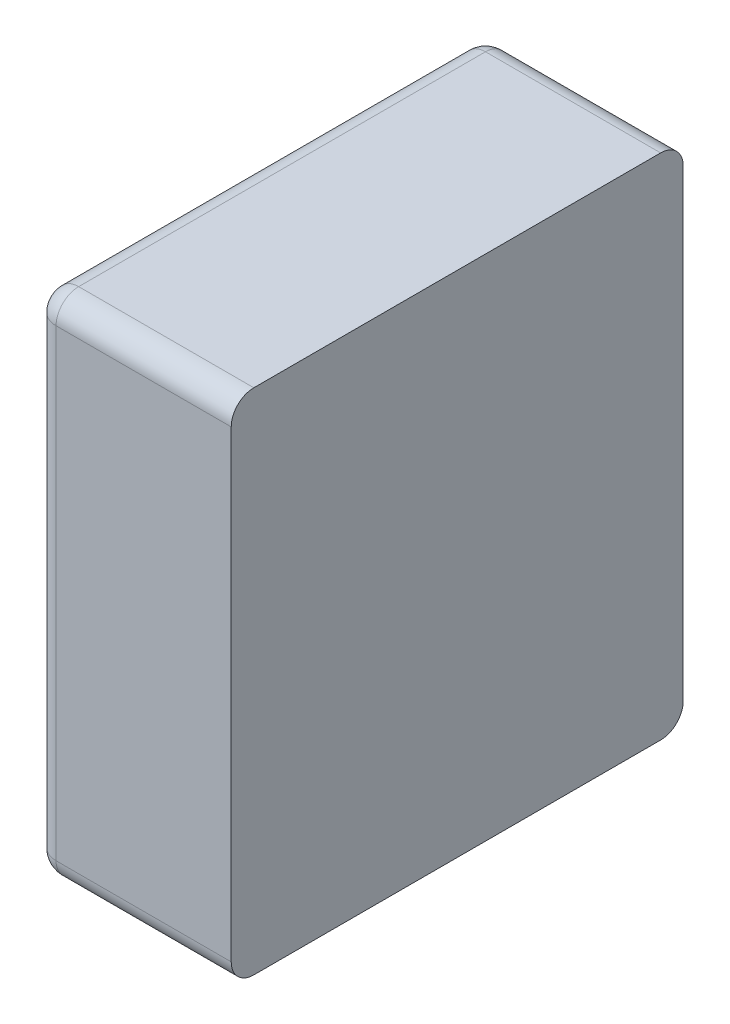
ISO-10303-21;
HEADER;
FILE_DESCRIPTION(('STEP AP214'),'2;1');
FILE_NAME('part.step','',(''),(''),'','','');
FILE_SCHEMA(('AUTOMOTIVE_DESIGN { 1 0 10303 214 1 1 1 1 }'));
ENDSEC;
DATA;
#1=APPLICATION_CONTEXT('core data for automotive mechanical design processes');
#2=APPLICATION_PROTOCOL_DEFINITION('international standard','automotive_design',2000,#1);
#3=PRODUCT_CONTEXT('',#1,'mechanical');
#4=PRODUCT('Part','Part','',(#3));
#5=PRODUCT_RELATED_PRODUCT_CATEGORY('part','',(#4));
#6=PRODUCT_DEFINITION_FORMATION('','',#4);
#7=PRODUCT_DEFINITION_CONTEXT('part definition',#1,'design');
#8=PRODUCT_DEFINITION('design','',#6,#7);
#9=PRODUCT_DEFINITION_SHAPE('','',#8);
#10=(LENGTH_UNIT() NAMED_UNIT(*) SI_UNIT(.MILLI.,.METRE.));
#11=(NAMED_UNIT(*) PLANE_ANGLE_UNIT() SI_UNIT($,.RADIAN.));
#12=(NAMED_UNIT(*) SI_UNIT($,.STERADIAN.) SOLID_ANGLE_UNIT());
#13=UNCERTAINTY_MEASURE_WITH_UNIT(LENGTH_MEASURE(1.E-05),#10,'distance_accuracy_value','');
#14=(GEOMETRIC_REPRESENTATION_CONTEXT(3) GLOBAL_UNCERTAINTY_ASSIGNED_CONTEXT((#13)) GLOBAL_UNIT_ASSIGNED_CONTEXT((#10,
#11,#12)) REPRESENTATION_CONTEXT('',''));
#15=CARTESIAN_POINT('',(0.,0.,0.));
#16=DIRECTION('',(0.,0.,1.));
#17=DIRECTION('',(1.,0.,0.));
#18=AXIS2_PLACEMENT_3D('',#15,#16,#17);
#19=CARTESIAN_POINT('',(-0.8,0.9,-0.4));
#20=DIRECTION('',(1.,0.,0.));
#21=DIRECTION('',(0.,0.,-1.));
#22=AXIS2_PLACEMENT_3D('',#19,#20,#21);
#23=PLANE('',#22);
#24=DIRECTION('',(0.,-1.,0.));
#25=VECTOR('',#24,1.);
#26=CARTESIAN_POINT('',(-0.8,0.9,-0.36));
#27=LINE('',#26,#25);
#28=CARTESIAN_POINT('',(-0.8,0.04,-0.36));
#29=VERTEX_POINT('',#28);
#30=CARTESIAN_POINT('',(-0.8,0.86,-0.36));
#31=VERTEX_POINT('',#30);
#32=EDGE_CURVE('E115',#29,#31,#27,.F.);
#33=ORIENTED_EDGE('',*,*,#32,.F.);
#34=DIRECTION('',(0.,0.,1.));
#35=VECTOR('',#34,1.);
#36=CARTESIAN_POINT('',(-0.8,0.04,-0.4));
#37=LINE('',#36,#35);
#38=CARTESIAN_POINT('',(-0.8,0.04,0.36));
#39=VERTEX_POINT('',#38);
#40=EDGE_CURVE('E112',#39,#29,#37,.F.);
#41=ORIENTED_EDGE('',*,*,#40,.F.);
#42=DIRECTION('',(0.,-1.,0.));
#43=VECTOR('',#42,1.);
#44=CARTESIAN_POINT('',(-0.8,0.9,0.36));
#45=LINE('',#44,#43);
#46=CARTESIAN_POINT('',(-0.8,0.86,0.36));
#47=VERTEX_POINT('',#46);
#48=EDGE_CURVE('E101',#47,#39,#45,.T.);
#49=ORIENTED_EDGE('',*,*,#48,.F.);
#50=DIRECTION('',(0.,0.,-1.));
#51=VECTOR('',#50,1.);
#52=CARTESIAN_POINT('',(-0.8,0.86,0.));
#53=LINE('',#52,#51);
#54=EDGE_CURVE('E156',#31,#47,#53,.F.);
#55=ORIENTED_EDGE('',*,*,#54,.F.);
#56=EDGE_LOOP('',(#33,#41,#49,#55));
#57=FACE_BOUND('',#56,.T.);
#58=ADVANCED_FACE('F17',(#57),#23,.F.);
#59=CARTESIAN_POINT('',(-0.76,0.04,0.36));
#60=DIRECTION('',(1.,0.,0.));
#61=DIRECTION('',(0.,0.,-1.));
#62=AXIS2_PLACEMENT_3D('',#59,#60,#61);
#63=SPHERICAL_SURFACE('',#62,0.04);
#64=CARTESIAN_POINT('',(-0.76,0.04,0.36));
#65=DIRECTION('',(0.,-1.,0.));
#66=DIRECTION('',(0.,0.,-1.));
#67=AXIS2_PLACEMENT_3D('',#64,#65,#66);
#68=CIRCLE('',#67,0.04);
#69=CARTESIAN_POINT('',(-0.76,0.04,0.4));
#70=VERTEX_POINT('',#69);
#71=EDGE_CURVE('E106',#39,#70,#68,.F.);
#72=ORIENTED_EDGE('',*,*,#71,.F.);
#73=CARTESIAN_POINT('',(-0.76,0.04,0.36));
#74=DIRECTION('',(0.,0.,1.));
#75=DIRECTION('',(1.,0.,0.));
#76=AXIS2_PLACEMENT_3D('',#73,#74,#75);
#77=CIRCLE('',#76,0.04);
#78=CARTESIAN_POINT('',(-0.76,0.,0.36));
#79=VERTEX_POINT('',#78);
#80=EDGE_CURVE('E117',#79,#39,#77,.F.);
#81=ORIENTED_EDGE('',*,*,#80,.F.);
#82=CARTESIAN_POINT('',(-0.76,0.04,0.36));
#83=DIRECTION('',(1.,0.,0.));
#84=DIRECTION('',(0.,0.,-1.));
#85=AXIS2_PLACEMENT_3D('',#82,#83,#84);
#86=CIRCLE('',#85,0.04);
#87=EDGE_CURVE('E126',#70,#79,#86,.T.);
#88=ORIENTED_EDGE('',*,*,#87,.F.);
#89=EDGE_LOOP('',(#72,#81,#88));
#90=FACE_BOUND('',#89,.T.);
#91=ADVANCED_FACE('F125',(#90),#63,.T.);
#92=CARTESIAN_POINT('',(-0.76,0.9,0.36));
#93=DIRECTION('',(0.,-1.,0.));
#94=DIRECTION('',(0.,0.,-1.));
#95=AXIS2_PLACEMENT_3D('',#92,#93,#94);
#96=CYLINDRICAL_SURFACE('',#95,0.04);
#97=CARTESIAN_POINT('',(-0.76,0.86,0.36));
#98=DIRECTION('',(0.,-1.,0.));
#99=DIRECTION('',(1.,0.,0.));
#100=AXIS2_PLACEMENT_3D('',#97,#98,#99);
#101=CIRCLE('',#100,0.04);
#102=CARTESIAN_POINT('',(-0.76,0.86,0.4));
#103=VERTEX_POINT('',#102);
#104=EDGE_CURVE('E108',#47,#103,#101,.F.);
#105=ORIENTED_EDGE('',*,*,#104,.F.);
#106=ORIENTED_EDGE('',*,*,#48,.T.);
#107=ORIENTED_EDGE('',*,*,#71,.T.);
#108=DIRECTION('',(0.,1.,0.));
#109=VECTOR('',#108,1.);
#110=CARTESIAN_POINT('',(-0.76,0.9,0.4));
#111=LINE('',#110,#109);
#112=EDGE_CURVE('E168',#70,#103,#111,.T.);
#113=ORIENTED_EDGE('',*,*,#112,.T.);
#114=EDGE_LOOP('',(#105,#106,#107,#113));
#115=FACE_BOUND('',#114,.T.);
#116=ADVANCED_FACE('F103',(#115),#96,.T.);
#117=CARTESIAN_POINT('',(-0.76,0.86,0.36));
#118=DIRECTION('',(1.,0.,0.));
#119=DIRECTION('',(0.,0.,-1.));
#120=AXIS2_PLACEMENT_3D('',#117,#118,#119);
#121=SPHERICAL_SURFACE('',#120,0.04);
#122=CARTESIAN_POINT('',(-0.76,0.86,0.36));
#123=DIRECTION('',(-1.,0.,0.));
#124=DIRECTION('',(0.,0.,1.));
#125=AXIS2_PLACEMENT_3D('',#122,#123,#124);
#126=CIRCLE('',#125,0.04);
#127=CARTESIAN_POINT('',(-0.76,0.9,0.36));
#128=VERTEX_POINT('',#127);
#129=EDGE_CURVE('E169',#128,#103,#126,.F.);
#130=ORIENTED_EDGE('',*,*,#129,.F.);
#131=CARTESIAN_POINT('',(-0.76,0.86,0.36));
#132=DIRECTION('',(0.,0.,-1.));
#133=DIRECTION('',(-1.,0.,0.));
#134=AXIS2_PLACEMENT_3D('',#131,#132,#133);
#135=CIRCLE('',#134,0.04);
#136=EDGE_CURVE('E152',#47,#128,#135,.T.);
#137=ORIENTED_EDGE('',*,*,#136,.F.);
#138=ORIENTED_EDGE('',*,*,#104,.T.);
#139=EDGE_LOOP('',(#130,#137,#138));
#140=FACE_BOUND('',#139,.T.);
#141=ADVANCED_FACE('F141',(#140),#121,.T.);
#142=CARTESIAN_POINT('',(-0.76,0.86,0.));
#143=DIRECTION('',(0.,0.,-1.));
#144=DIRECTION('',(-1.,0.,0.));
#145=AXIS2_PLACEMENT_3D('',#142,#143,#144);
#146=CYLINDRICAL_SURFACE('',#145,0.04);
#147=CARTESIAN_POINT('',(-0.76,0.86,-0.36));
#148=DIRECTION('',(0.,0.,1.));
#149=DIRECTION('',(1.,0.,0.));
#150=AXIS2_PLACEMENT_3D('',#147,#148,#149);
#151=CIRCLE('',#150,0.04);
#152=CARTESIAN_POINT('',(-0.76,0.9,-0.36));
#153=VERTEX_POINT('',#152);
#154=EDGE_CURVE('E161',#31,#153,#151,.F.);
#155=ORIENTED_EDGE('',*,*,#154,.F.);
#156=ORIENTED_EDGE('',*,*,#54,.T.);
#157=ORIENTED_EDGE('',*,*,#136,.T.);
#158=DIRECTION('',(0.,0.,1.));
#159=VECTOR('',#158,1.);
#160=CARTESIAN_POINT('',(-0.76,0.9,0.));
#161=LINE('',#160,#159);
#162=EDGE_CURVE('E245',#153,#128,#161,.T.);
#163=ORIENTED_EDGE('',*,*,#162,.F.);
#164=EDGE_LOOP('',(#155,#156,#157,#163));
#165=FACE_BOUND('',#164,.T.);
#166=ADVANCED_FACE('F145',(#165),#146,.T.);
#167=CARTESIAN_POINT('',(-0.76,0.86,-0.36));
#168=DIRECTION('',(1.,0.,0.));
#169=DIRECTION('',(0.,0.,-1.));
#170=AXIS2_PLACEMENT_3D('',#167,#168,#169);
#171=SPHERICAL_SURFACE('',#170,0.04);
#172=CARTESIAN_POINT('',(-0.76,0.86,-0.36));
#173=DIRECTION('',(1.,0.,0.));
#174=DIRECTION('',(0.,0.,-1.));
#175=AXIS2_PLACEMENT_3D('',#172,#173,#174);
#176=CIRCLE('',#175,0.04);
#177=CARTESIAN_POINT('',(-0.76,0.86,-0.4));
#178=VERTEX_POINT('',#177);
#179=EDGE_CURVE('E240',#178,#153,#176,.T.);
#180=ORIENTED_EDGE('',*,*,#179,.F.);
#181=CARTESIAN_POINT('',(-0.76,0.86,-0.36));
#182=DIRECTION('',(0.,-1.,0.));
#183=DIRECTION('',(0.,0.,-1.));
#184=AXIS2_PLACEMENT_3D('',#181,#182,#183);
#185=CIRCLE('',#184,0.04);
#186=EDGE_CURVE('E228',#31,#178,#185,.T.);
#187=ORIENTED_EDGE('',*,*,#186,.F.);
#188=ORIENTED_EDGE('',*,*,#154,.T.);
#189=EDGE_LOOP('',(#180,#187,#188));
#190=FACE_BOUND('',#189,.T.);
#191=ADVANCED_FACE('F217',(#190),#171,.T.);
#192=CARTESIAN_POINT('',(-0.76,0.9,-0.36));
#193=DIRECTION('',(0.,-1.,0.));
#194=DIRECTION('',(0.,0.,-1.));
#195=AXIS2_PLACEMENT_3D('',#192,#193,#194);
#196=CYLINDRICAL_SURFACE('',#195,0.04);
#197=CARTESIAN_POINT('',(-0.76,0.04,-0.36));
#198=DIRECTION('',(0.,1.,0.));
#199=DIRECTION('',(1.,0.,0.));
#200=AXIS2_PLACEMENT_3D('',#197,#198,#199);
#201=CIRCLE('',#200,0.04);
#202=CARTESIAN_POINT('',(-0.76,0.04,-0.4));
#203=VERTEX_POINT('',#202);
#204=EDGE_CURVE('E123',#29,#203,#201,.F.);
#205=ORIENTED_EDGE('',*,*,#204,.F.);
#206=ORIENTED_EDGE('',*,*,#32,.T.);
#207=ORIENTED_EDGE('',*,*,#186,.T.);
#208=DIRECTION('',(0.,1.,0.));
#209=VECTOR('',#208,1.);
#210=CARTESIAN_POINT('',(-0.76,0.9,-0.4));
#211=LINE('',#210,#209);
#212=EDGE_CURVE('E187',#178,#203,#211,.F.);
#213=ORIENTED_EDGE('',*,*,#212,.T.);
#214=EDGE_LOOP('',(#205,#206,#207,#213));
#215=FACE_BOUND('',#214,.T.);
#216=ADVANCED_FACE('F213',(#215),#196,.T.);
#217=CARTESIAN_POINT('',(-0.76,0.04,-0.36));
#218=DIRECTION('',(1.,0.,0.));
#219=DIRECTION('',(0.,0.,-1.));
#220=AXIS2_PLACEMENT_3D('',#217,#218,#219);
#221=SPHERICAL_SURFACE('',#220,0.04);
#222=CARTESIAN_POINT('',(-0.76,0.04,-0.36));
#223=DIRECTION('',(0.,0.,1.));
#224=DIRECTION('',(1.,0.,0.));
#225=AXIS2_PLACEMENT_3D('',#222,#223,#224);
#226=CIRCLE('',#225,0.04);
#227=CARTESIAN_POINT('',(-0.76,0.,-0.36));
#228=VERTEX_POINT('',#227);
#229=EDGE_CURVE('E66',#29,#228,#226,.T.);
#230=ORIENTED_EDGE('',*,*,#229,.F.);
#231=ORIENTED_EDGE('',*,*,#204,.T.);
#232=CARTESIAN_POINT('',(-0.76,0.04,-0.36));
#233=DIRECTION('',(-1.,0.,0.));
#234=DIRECTION('',(0.,0.,1.));
#235=AXIS2_PLACEMENT_3D('',#232,#233,#234);
#236=CIRCLE('',#235,0.04);
#237=EDGE_CURVE('E183',#228,#203,#236,.F.);
#238=ORIENTED_EDGE('',*,*,#237,.F.);
#239=EDGE_LOOP('',(#230,#231,#238));
#240=FACE_BOUND('',#239,.T.);
#241=ADVANCED_FACE('F209',(#240),#221,.T.);
#242=CARTESIAN_POINT('',(-0.76,0.04,-0.4));
#243=DIRECTION('',(0.,0.,1.));
#244=DIRECTION('',(1.,0.,0.));
#245=AXIS2_PLACEMENT_3D('',#242,#243,#244);
#246=CYLINDRICAL_SURFACE('',#245,0.04);
#247=ORIENTED_EDGE('',*,*,#229,.T.);
#248=DIRECTION('',(0.,0.,1.));
#249=VECTOR('',#248,1.);
#250=CARTESIAN_POINT('',(-0.76,0.,0.));
#251=LINE('',#250,#249);
#252=EDGE_CURVE('E121',#228,#79,#251,.T.);
#253=ORIENTED_EDGE('',*,*,#252,.T.);
#254=ORIENTED_EDGE('',*,*,#80,.T.);
#255=ORIENTED_EDGE('',*,*,#40,.T.);
#256=EDGE_LOOP('',(#247,#253,#254,#255));
#257=FACE_BOUND('',#256,.T.);
#258=ADVANCED_FACE('F120',(#257),#246,.T.);
#259=CARTESIAN_POINT('',(-0.8,0.04,0.36));
#260=DIRECTION('',(1.,0.,0.));
#261=DIRECTION('',(0.,0.,-1.));
#262=AXIS2_PLACEMENT_3D('',#259,#260,#261);
#263=CYLINDRICAL_SURFACE('',#262,0.04);
#264=ORIENTED_EDGE('',*,*,#87,.T.);
#265=DIRECTION('',(1.,0.,0.));
#266=VECTOR('',#265,1.);
#267=CARTESIAN_POINT('',(0.,0.,0.36));
#268=LINE('',#267,#266);
#269=CARTESIAN_POINT('',(-0.45,0.,0.36));
#270=VERTEX_POINT('',#269);
#271=EDGE_CURVE('E265',#79,#270,#268,.T.);
#272=ORIENTED_EDGE('',*,*,#271,.T.);
#273=CARTESIAN_POINT('',(-0.45,0.04,0.36));
#274=DIRECTION('',(1.,0.,0.));
#275=DIRECTION('',(0.,0.,-1.));
#276=AXIS2_PLACEMENT_3D('',#273,#274,#275);
#277=CIRCLE('',#276,0.04);
#278=CARTESIAN_POINT('',(-0.45,0.04,0.4));
#279=VERTEX_POINT('',#278);
#280=EDGE_CURVE('E20',#270,#279,#277,.F.);
#281=ORIENTED_EDGE('',*,*,#280,.T.);
#282=DIRECTION('',(-1.,0.,0.));
#283=VECTOR('',#282,1.);
#284=CARTESIAN_POINT('',(-0.8,0.04,0.4));
#285=LINE('',#284,#283);
#286=EDGE_CURVE('E170',#279,#70,#285,.T.);
#287=ORIENTED_EDGE('',*,*,#286,.T.);
#288=EDGE_LOOP('',(#264,#272,#281,#287));
#289=FACE_BOUND('',#288,.T.);
#290=ADVANCED_FACE('F300',(#289),#263,.T.);
#291=CARTESIAN_POINT('',(-0.8,0.9,0.4));
#292=DIRECTION('',(0.,0.,-1.));
#293=DIRECTION('',(-1.,0.,0.));
#294=AXIS2_PLACEMENT_3D('',#291,#292,#293);
#295=PLANE('',#294);
#296=ORIENTED_EDGE('',*,*,#286,.F.);
#297=DIRECTION('',(0.,1.,0.));
#298=VECTOR('',#297,1.);
#299=CARTESIAN_POINT('',(-0.45,0.9,0.4));
#300=LINE('',#299,#298);
#301=CARTESIAN_POINT('',(-0.45,0.86,0.4));
#302=VERTEX_POINT('',#301);
#303=EDGE_CURVE('E272',#279,#302,#300,.T.);
#304=ORIENTED_EDGE('',*,*,#303,.T.);
#305=DIRECTION('',(-1.,0.,0.));
#306=VECTOR('',#305,1.);
#307=CARTESIAN_POINT('',(0.,0.86,0.4));
#308=LINE('',#307,#306);
#309=EDGE_CURVE('E172',#103,#302,#308,.F.);
#310=ORIENTED_EDGE('',*,*,#309,.F.);
#311=ORIENTED_EDGE('',*,*,#112,.F.);
#312=EDGE_LOOP('',(#296,#304,#310,#311));
#313=FACE_BOUND('',#312,.T.);
#314=ADVANCED_FACE('F298',(#313),#295,.F.);
#315=CARTESIAN_POINT('',(0.,0.86,0.36));
#316=DIRECTION('',(-1.,0.,0.));
#317=DIRECTION('',(0.,0.,1.));
#318=AXIS2_PLACEMENT_3D('',#315,#316,#317);
#319=CYLINDRICAL_SURFACE('',#318,0.04);
#320=ORIENTED_EDGE('',*,*,#129,.T.);
#321=ORIENTED_EDGE('',*,*,#309,.T.);
#322=CARTESIAN_POINT('',(-0.45,0.86,0.36));
#323=DIRECTION('',(-1.,0.,0.));
#324=DIRECTION('',(0.,0.,1.));
#325=AXIS2_PLACEMENT_3D('',#322,#323,#324);
#326=CIRCLE('',#325,0.04);
#327=CARTESIAN_POINT('',(-0.45,0.9,0.36));
#328=VERTEX_POINT('',#327);
#329=EDGE_CURVE('E275',#302,#328,#326,.T.);
#330=ORIENTED_EDGE('',*,*,#329,.T.);
#331=DIRECTION('',(1.,0.,0.));
#332=VECTOR('',#331,1.);
#333=CARTESIAN_POINT('',(0.,0.9,0.36));
#334=LINE('',#333,#332);
#335=EDGE_CURVE('E243',#128,#328,#334,.T.);
#336=ORIENTED_EDGE('',*,*,#335,.F.);
#337=EDGE_LOOP('',(#320,#321,#330,#336));
#338=FACE_BOUND('',#337,.T.);
#339=ADVANCED_FACE('F293',(#338),#319,.T.);
#340=CARTESIAN_POINT('',(0.,0.9,0.));
#341=DIRECTION('',(0.,1.,0.));
#342=DIRECTION('',(0.,0.,1.));
#343=AXIS2_PLACEMENT_3D('',#340,#341,#342);
#344=PLANE('',#343);
#345=ORIENTED_EDGE('',*,*,#162,.T.);
#346=ORIENTED_EDGE('',*,*,#335,.T.);
#347=DIRECTION('',(0.,0.,1.));
#348=VECTOR('',#347,1.);
#349=CARTESIAN_POINT('',(-0.45,0.9,-0.4));
#350=LINE('',#349,#348);
#351=CARTESIAN_POINT('',(-0.45,0.9,-0.36));
#352=VERTEX_POINT('',#351);
#353=EDGE_CURVE('E276',#328,#352,#350,.F.);
#354=ORIENTED_EDGE('',*,*,#353,.T.);
#355=DIRECTION('',(1.,0.,0.));
#356=VECTOR('',#355,1.);
#357=CARTESIAN_POINT('',(0.,0.9,-0.36));
#358=LINE('',#357,#356);
#359=EDGE_CURVE('E242',#153,#352,#358,.T.);
#360=ORIENTED_EDGE('',*,*,#359,.F.);
#361=EDGE_LOOP('',(#345,#346,#354,#360));
#362=FACE_BOUND('',#361,.T.);
#363=ADVANCED_FACE('F307',(#362),#344,.T.);
#364=CARTESIAN_POINT('',(0.,0.86,-0.36));
#365=DIRECTION('',(1.,0.,0.));
#366=DIRECTION('',(0.,0.,-1.));
#367=AXIS2_PLACEMENT_3D('',#364,#365,#366);
#368=CYLINDRICAL_SURFACE('',#367,0.04);
#369=ORIENTED_EDGE('',*,*,#179,.T.);
#370=ORIENTED_EDGE('',*,*,#359,.T.);
#371=CARTESIAN_POINT('',(-0.45,0.86,-0.36));
#372=DIRECTION('',(1.,0.,0.));
#373=DIRECTION('',(0.,0.,-1.));
#374=AXIS2_PLACEMENT_3D('',#371,#372,#373);
#375=CIRCLE('',#374,0.04);
#376=CARTESIAN_POINT('',(-0.45,0.86,-0.4));
#377=VERTEX_POINT('',#376);
#378=EDGE_CURVE('E279',#352,#377,#375,.F.);
#379=ORIENTED_EDGE('',*,*,#378,.T.);
#380=DIRECTION('',(1.,0.,0.));
#381=VECTOR('',#380,1.);
#382=CARTESIAN_POINT('',(-0.8,0.86,-0.4));
#383=LINE('',#382,#381);
#384=EDGE_CURVE('E202',#377,#178,#383,.F.);
#385=ORIENTED_EDGE('',*,*,#384,.T.);
#386=EDGE_LOOP('',(#369,#370,#379,#385));
#387=FACE_BOUND('',#386,.T.);
#388=ADVANCED_FACE('F324',(#387),#368,.T.);
#389=CARTESIAN_POINT('',(-0.8,0.9,-0.4));
#390=DIRECTION('',(0.,0.,1.));
#391=DIRECTION('',(1.,0.,0.));
#392=AXIS2_PLACEMENT_3D('',#389,#390,#391);
#393=PLANE('',#392);
#394=DIRECTION('',(-1.,0.,0.));
#395=VECTOR('',#394,1.);
#396=CARTESIAN_POINT('',(-0.8,0.04,-0.4));
#397=LINE('',#396,#395);
#398=CARTESIAN_POINT('',(-0.45,0.04,-0.4));
#399=VERTEX_POINT('',#398);
#400=EDGE_CURVE('E186',#203,#399,#397,.F.);
#401=ORIENTED_EDGE('',*,*,#400,.F.);
#402=ORIENTED_EDGE('',*,*,#212,.F.);
#403=ORIENTED_EDGE('',*,*,#384,.F.);
#404=DIRECTION('',(0.,1.,0.));
#405=VECTOR('',#404,1.);
#406=CARTESIAN_POINT('',(-0.45,0.9,-0.4));
#407=LINE('',#406,#405);
#408=EDGE_CURVE('E280',#377,#399,#407,.F.);
#409=ORIENTED_EDGE('',*,*,#408,.T.);
#410=EDGE_LOOP('',(#401,#402,#403,#409));
#411=FACE_BOUND('',#410,.T.);
#412=ADVANCED_FACE('F320',(#411),#393,.F.);
#413=CARTESIAN_POINT('',(-0.8,0.04,-0.36));
#414=DIRECTION('',(-1.,0.,0.));
#415=DIRECTION('',(0.,0.,1.));
#416=AXIS2_PLACEMENT_3D('',#413,#414,#415);
#417=CYLINDRICAL_SURFACE('',#416,0.04);
#418=ORIENTED_EDGE('',*,*,#237,.T.);
#419=ORIENTED_EDGE('',*,*,#400,.T.);
#420=CARTESIAN_POINT('',(-0.45,0.04,-0.36));
#421=DIRECTION('',(-1.,0.,0.));
#422=DIRECTION('',(0.,0.,1.));
#423=AXIS2_PLACEMENT_3D('',#420,#421,#422);
#424=CIRCLE('',#423,0.04);
#425=CARTESIAN_POINT('',(-0.45,0.,-0.36));
#426=VERTEX_POINT('',#425);
#427=EDGE_CURVE('E26',#399,#426,#424,.T.);
#428=ORIENTED_EDGE('',*,*,#427,.T.);
#429=DIRECTION('',(1.,0.,0.));
#430=VECTOR('',#429,1.);
#431=CARTESIAN_POINT('',(0.,0.,-0.36));
#432=LINE('',#431,#430);
#433=EDGE_CURVE('E34',#426,#228,#432,.F.);
#434=ORIENTED_EDGE('',*,*,#433,.T.);
#435=EDGE_LOOP('',(#418,#419,#428,#434));
#436=FACE_BOUND('',#435,.T.);
#437=ADVANCED_FACE('F315',(#436),#417,.T.);
#438=CARTESIAN_POINT('',(0.,0.,0.));
#439=DIRECTION('',(0.,1.,0.));
#440=DIRECTION('',(0.,0.,1.));
#441=AXIS2_PLACEMENT_3D('',#438,#439,#440);
#442=PLANE('',#441);
#443=ORIENTED_EDGE('',*,*,#433,.F.);
#444=DIRECTION('',(0.,0.,1.));
#445=VECTOR('',#444,1.);
#446=CARTESIAN_POINT('',(-0.45,0.,-0.4));
#447=LINE('',#446,#445);
#448=EDGE_CURVE('E11',#426,#270,#447,.T.);
#449=ORIENTED_EDGE('',*,*,#448,.T.);
#450=ORIENTED_EDGE('',*,*,#271,.F.);
#451=ORIENTED_EDGE('',*,*,#252,.F.);
#452=EDGE_LOOP('',(#443,#449,#450,#451));
#453=FACE_BOUND('',#452,.T.);
#454=ADVANCED_FACE('F310',(#453),#442,.F.);
#455=CARTESIAN_POINT('',(-0.45,0.9,-0.4));
#456=DIRECTION('',(-1.,0.,0.));
#457=DIRECTION('',(0.,0.,1.));
#458=AXIS2_PLACEMENT_3D('',#455,#456,#457);
#459=PLANE('',#458);
#460=ORIENTED_EDGE('',*,*,#427,.F.);
#461=ORIENTED_EDGE('',*,*,#408,.F.);
#462=ORIENTED_EDGE('',*,*,#378,.F.);
#463=ORIENTED_EDGE('',*,*,#353,.F.);
#464=ORIENTED_EDGE('',*,*,#329,.F.);
#465=ORIENTED_EDGE('',*,*,#303,.F.);
#466=ORIENTED_EDGE('',*,*,#280,.F.);
#467=ORIENTED_EDGE('',*,*,#448,.F.);
#468=EDGE_LOOP('',(#460,#461,#462,#463,#464,#465,#466,#467));
#469=FACE_BOUND('',#468,.T.);
#470=ADVANCED_FACE('F296',(#469),#459,.F.);
#471=CLOSED_SHELL('',(#58,#91,#116,#141,#166,#191,#216,#241,#258,#290,#314,#339,#363,#388,#412,
#437,#454,#470));
#472=MANIFOLD_SOLID_BREP('B1',#471);
#473=ADVANCED_BREP_SHAPE_REPRESENTATION('',(#18,#472),#14);
#474=SHAPE_DEFINITION_REPRESENTATION(#9,#473);
ENDSEC;
END-ISO-10303-21;
